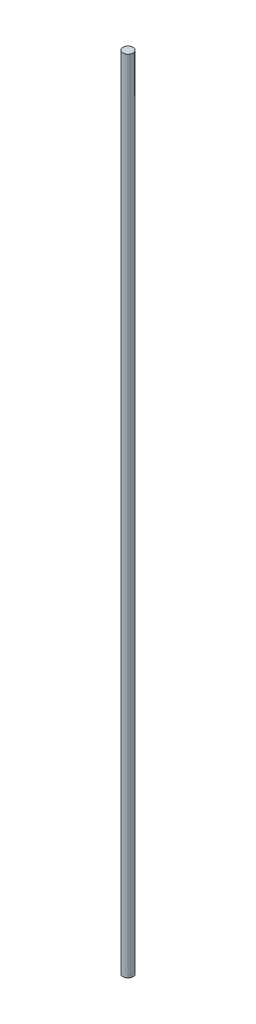
ISO-10303-21;
HEADER;
FILE_DESCRIPTION(('STEP AP214'),'2;1');
FILE_NAME('part.step','',(''),(''),'','','');
FILE_SCHEMA(('AUTOMOTIVE_DESIGN { 1 0 10303 214 1 1 1 1 }'));
ENDSEC;
DATA;
#1=APPLICATION_CONTEXT('core data for automotive mechanical design processes');
#2=APPLICATION_PROTOCOL_DEFINITION('international standard','automotive_design',2000,#1);
#3=PRODUCT_CONTEXT('',#1,'mechanical');
#4=PRODUCT('Part','Part','',(#3));
#5=PRODUCT_RELATED_PRODUCT_CATEGORY('part','',(#4));
#6=PRODUCT_DEFINITION_FORMATION('','',#4);
#7=PRODUCT_DEFINITION_CONTEXT('part definition',#1,'design');
#8=PRODUCT_DEFINITION('design','',#6,#7);
#9=PRODUCT_DEFINITION_SHAPE('','',#8);
#10=(LENGTH_UNIT() NAMED_UNIT(*) SI_UNIT(.MILLI.,.METRE.));
#11=(NAMED_UNIT(*) PLANE_ANGLE_UNIT() SI_UNIT($,.RADIAN.));
#12=(NAMED_UNIT(*) SI_UNIT($,.STERADIAN.) SOLID_ANGLE_UNIT());
#13=UNCERTAINTY_MEASURE_WITH_UNIT(LENGTH_MEASURE(1.E-05),#10,'distance_accuracy_value','');
#14=(GEOMETRIC_REPRESENTATION_CONTEXT(3) GLOBAL_UNCERTAINTY_ASSIGNED_CONTEXT((#13)) GLOBAL_UNIT_ASSIGNED_CONTEXT((#10,
#11,#12)) REPRESENTATION_CONTEXT('',''));
#15=CARTESIAN_POINT('',(0.,0.,0.));
#16=DIRECTION('',(0.,0.,1.));
#17=DIRECTION('',(1.,0.,0.));
#18=AXIS2_PLACEMENT_3D('',#15,#16,#17);
#19=CARTESIAN_POINT('',(0.,500.,0.));
#20=DIRECTION('',(0.,-1.,0.));
#21=DIRECTION('',(0.,0.,-1.));
#22=AXIS2_PLACEMENT_3D('',#19,#20,#21);
#23=CYLINDRICAL_SURFACE('',#22,3.175);
#24=CARTESIAN_POINT('',(0.,500.,0.));
#25=DIRECTION('',(0.,1.,0.));
#26=DIRECTION('',(0.,0.,1.));
#27=AXIS2_PLACEMENT_3D('',#24,#25,#26);
#28=CIRCLE('',#27,3.175);
#29=CARTESIAN_POINT('',(0.,500.,3.175));
#30=VERTEX_POINT('',#29);
#31=EDGE_CURVE('E10',#30,#30,#28,.T.);
#32=ORIENTED_EDGE('',*,*,#31,.F.);
#33=EDGE_LOOP('',(#32));
#34=FACE_BOUND('',#33,.T.);
#35=CARTESIAN_POINT('',(0.,0.,0.));
#36=DIRECTION('',(0.,1.,0.));
#37=DIRECTION('',(0.,0.,1.));
#38=AXIS2_PLACEMENT_3D('',#35,#36,#37);
#39=CIRCLE('',#38,3.175);
#40=CARTESIAN_POINT('',(0.,0.,3.175));
#41=VERTEX_POINT('',#40);
#42=EDGE_CURVE('E36',#41,#41,#39,.T.);
#43=ORIENTED_EDGE('',*,*,#42,.T.);
#44=EDGE_LOOP('',(#43));
#45=FACE_BOUND('',#44,.T.);
#46=ADVANCED_FACE('F33',(#34,#45),#23,.T.);
#47=CARTESIAN_POINT('',(0.,500.,0.));
#48=DIRECTION('',(0.,1.,0.));
#49=DIRECTION('',(0.,0.,1.));
#50=AXIS2_PLACEMENT_3D('',#47,#48,#49);
#51=PLANE('',#50);
#52=ORIENTED_EDGE('',*,*,#31,.T.);
#53=EDGE_LOOP('',(#52));
#54=FACE_BOUND('',#53,.T.);
#55=ADVANCED_FACE('F48',(#54),#51,.T.);
#56=CARTESIAN_POINT('',(0.,0.,0.));
#57=DIRECTION('',(0.,1.,0.));
#58=DIRECTION('',(0.,0.,1.));
#59=AXIS2_PLACEMENT_3D('',#56,#57,#58);
#60=PLANE('',#59);
#61=ORIENTED_EDGE('',*,*,#42,.F.);
#62=EDGE_LOOP('',(#61));
#63=FACE_BOUND('',#62,.T.);
#64=ADVANCED_FACE('F46',(#63),#60,.F.);
#65=CLOSED_SHELL('',(#46,#55,#64));
#66=MANIFOLD_SOLID_BREP('B2',#65);
#67=ADVANCED_BREP_SHAPE_REPRESENTATION('',(#18,#66),#14);
#68=SHAPE_DEFINITION_REPRESENTATION(#9,#67);
ENDSEC;
END-ISO-10303-21;
